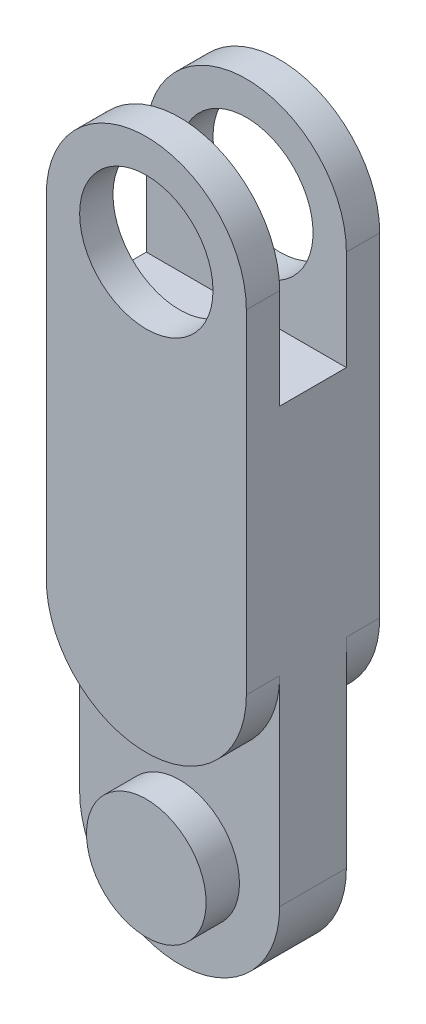
ISO-10303-21;
HEADER;
FILE_DESCRIPTION(('STEP AP214'),'2;1');
FILE_NAME('part.step','',(''),(''),'','','');
FILE_SCHEMA(('AUTOMOTIVE_DESIGN { 1 0 10303 214 1 1 1 1 }'));
ENDSEC;
DATA;
#1=APPLICATION_CONTEXT('core data for automotive mechanical design processes');
#2=APPLICATION_PROTOCOL_DEFINITION('international standard','automotive_design',2000,#1);
#3=PRODUCT_CONTEXT('',#1,'mechanical');
#4=PRODUCT('Part','Part','',(#3));
#5=PRODUCT_RELATED_PRODUCT_CATEGORY('part','',(#4));
#6=PRODUCT_DEFINITION_FORMATION('','',#4);
#7=PRODUCT_DEFINITION_CONTEXT('part definition',#1,'design');
#8=PRODUCT_DEFINITION('design','',#6,#7);
#9=PRODUCT_DEFINITION_SHAPE('','',#8);
#10=(LENGTH_UNIT() NAMED_UNIT(*) SI_UNIT(.MILLI.,.METRE.));
#11=(NAMED_UNIT(*) PLANE_ANGLE_UNIT() SI_UNIT($,.RADIAN.));
#12=(NAMED_UNIT(*) SI_UNIT($,.STERADIAN.) SOLID_ANGLE_UNIT());
#13=UNCERTAINTY_MEASURE_WITH_UNIT(LENGTH_MEASURE(1.E-05),#10,'distance_accuracy_value','');
#14=(GEOMETRIC_REPRESENTATION_CONTEXT(3) GLOBAL_UNCERTAINTY_ASSIGNED_CONTEXT((#13)) GLOBAL_UNIT_ASSIGNED_CONTEXT((#10,
#11,#12)) REPRESENTATION_CONTEXT('',''));
#15=CARTESIAN_POINT('',(0.,0.,0.));
#16=DIRECTION('',(0.,0.,1.));
#17=DIRECTION('',(1.,0.,0.));
#18=AXIS2_PLACEMENT_3D('',#15,#16,#17);
#19=CARTESIAN_POINT('',(-15.,0.,10.));
#20=DIRECTION('',(1.,0.,0.));
#21=DIRECTION('',(0.,0.,-1.));
#22=AXIS2_PLACEMENT_3D('',#19,#20,#21);
#23=PLANE('',#22);
#24=DIRECTION('',(0.,-1.,0.));
#25=VECTOR('',#24,1.);
#26=CARTESIAN_POINT('',(-15.,30.,5.));
#27=LINE('',#26,#25);
#28=CARTESIAN_POINT('',(-15.,30.,5.));
#29=VERTEX_POINT('',#28);
#30=CARTESIAN_POINT('',(-15.,0.,5.));
#31=VERTEX_POINT('',#30);
#32=EDGE_CURVE('E145',#29,#31,#27,.T.);
#33=ORIENTED_EDGE('',*,*,#32,.F.);
#34=DIRECTION('',(0.,0.,-1.));
#35=VECTOR('',#34,1.);
#36=CARTESIAN_POINT('',(-15.,30.,10.));
#37=LINE('',#36,#35);
#38=CARTESIAN_POINT('',(-15.,30.,10.));
#39=VERTEX_POINT('',#38);
#40=EDGE_CURVE('E132',#39,#29,#37,.T.);
#41=ORIENTED_EDGE('',*,*,#40,.F.);
#42=DIRECTION('',(0.,-1.,0.));
#43=VECTOR('',#42,1.);
#44=CARTESIAN_POINT('',(-15.,0.,10.));
#45=LINE('',#44,#43);
#46=CARTESIAN_POINT('',(-15.,80.,10.));
#47=VERTEX_POINT('',#46);
#48=EDGE_CURVE('E144',#47,#39,#45,.T.);
#49=ORIENTED_EDGE('',*,*,#48,.F.);
#50=DIRECTION('',(0.,0.,-1.));
#51=VECTOR('',#50,1.);
#52=CARTESIAN_POINT('',(-15.,80.,10.));
#53=LINE('',#52,#51);
#54=CARTESIAN_POINT('',(-15.,80.,5.));
#55=VERTEX_POINT('',#54);
#56=EDGE_CURVE('E169',#47,#55,#53,.T.);
#57=ORIENTED_EDGE('',*,*,#56,.T.);
#58=DIRECTION('',(0.,1.,0.));
#59=VECTOR('',#58,1.);
#60=CARTESIAN_POINT('',(-15.,65.,5.));
#61=LINE('',#60,#59);
#62=CARTESIAN_POINT('',(-15.,65.,5.));
#63=VERTEX_POINT('',#62);
#64=EDGE_CURVE('E210',#63,#55,#61,.T.);
#65=ORIENTED_EDGE('',*,*,#64,.F.);
#66=DIRECTION('',(0.,0.,1.));
#67=VECTOR('',#66,1.);
#68=CARTESIAN_POINT('',(-15.,65.,-5.));
#69=LINE('',#68,#67);
#70=CARTESIAN_POINT('',(-15.,65.,-5.));
#71=VERTEX_POINT('',#70);
#72=EDGE_CURVE('E213',#71,#63,#69,.T.);
#73=ORIENTED_EDGE('',*,*,#72,.F.);
#74=DIRECTION('',(0.,1.,0.));
#75=VECTOR('',#74,1.);
#76=CARTESIAN_POINT('',(-15.,65.,-5.));
#77=LINE('',#76,#75);
#78=CARTESIAN_POINT('',(-15.,80.,-5.));
#79=VERTEX_POINT('',#78);
#80=EDGE_CURVE('E186',#71,#79,#77,.T.);
#81=ORIENTED_EDGE('',*,*,#80,.T.);
#82=CARTESIAN_POINT('',(-15.,80.,-10.));
#83=VERTEX_POINT('',#82);
#84=EDGE_CURVE('E154',#79,#83,#53,.T.);
#85=ORIENTED_EDGE('',*,*,#84,.T.);
#86=DIRECTION('',(0.,-1.,0.));
#87=VECTOR('',#86,1.);
#88=CARTESIAN_POINT('',(-15.,0.,-10.));
#89=LINE('',#88,#87);
#90=CARTESIAN_POINT('',(-15.,30.,-10.));
#91=VERTEX_POINT('',#90);
#92=EDGE_CURVE('E166',#83,#91,#89,.T.);
#93=ORIENTED_EDGE('',*,*,#92,.T.);
#94=DIRECTION('',(0.,0.,1.));
#95=VECTOR('',#94,1.);
#96=CARTESIAN_POINT('',(-15.,30.,-10.));
#97=LINE('',#96,#95);
#98=CARTESIAN_POINT('',(-15.,30.,-5.));
#99=VERTEX_POINT('',#98);
#100=EDGE_CURVE('E223',#91,#99,#97,.T.);
#101=ORIENTED_EDGE('',*,*,#100,.T.);
#102=DIRECTION('',(0.,-1.,0.));
#103=VECTOR('',#102,1.);
#104=CARTESIAN_POINT('',(-15.,30.,-5.));
#105=LINE('',#104,#103);
#106=CARTESIAN_POINT('',(-15.,0.,-5.));
#107=VERTEX_POINT('',#106);
#108=EDGE_CURVE('E233',#99,#107,#105,.T.);
#109=ORIENTED_EDGE('',*,*,#108,.T.);
#110=DIRECTION('',(0.,0.,-1.));
#111=VECTOR('',#110,1.);
#112=CARTESIAN_POINT('',(-15.,0.,10.));
#113=LINE('',#112,#111);
#114=EDGE_CURVE('E64',#31,#107,#113,.T.);
#115=ORIENTED_EDGE('',*,*,#114,.F.);
#116=EDGE_LOOP('',(#33,#41,#49,#57,#65,#73,#81,#85,#93,#101,#109,#115));
#117=FACE_BOUND('',#116,.T.);
#118=ADVANCED_FACE('F39',(#117),#23,.F.);
#119=CARTESIAN_POINT('',(0.,0.,10.));
#120=DIRECTION('',(0.,0.,-1.));
#121=DIRECTION('',(-1.,0.,0.));
#122=AXIS2_PLACEMENT_3D('',#119,#120,#121);
#123=CYLINDRICAL_SURFACE('',#122,15.);
#124=CARTESIAN_POINT('',(0.,0.,5.));
#125=DIRECTION('',(0.,0.,1.));
#126=DIRECTION('',(1.,0.,0.));
#127=AXIS2_PLACEMENT_3D('',#124,#125,#126);
#128=CIRCLE('',#127,15.);
#129=CARTESIAN_POINT('',(15.,0.,5.));
#130=VERTEX_POINT('',#129);
#131=EDGE_CURVE('E248',#31,#130,#128,.T.);
#132=ORIENTED_EDGE('',*,*,#131,.F.);
#133=ORIENTED_EDGE('',*,*,#114,.T.);
#134=CARTESIAN_POINT('',(0.,0.,-5.));
#135=DIRECTION('',(0.,0.,1.));
#136=DIRECTION('',(1.,0.,0.));
#137=AXIS2_PLACEMENT_3D('',#134,#135,#136);
#138=CIRCLE('',#137,15.);
#139=CARTESIAN_POINT('',(15.,0.,-5.));
#140=VERTEX_POINT('',#139);
#141=EDGE_CURVE('E231',#107,#140,#138,.T.);
#142=ORIENTED_EDGE('',*,*,#141,.T.);
#143=DIRECTION('',(0.,0.,-1.));
#144=VECTOR('',#143,1.);
#145=CARTESIAN_POINT('',(15.,0.,10.));
#146=LINE('',#145,#144);
#147=EDGE_CURVE('E11',#130,#140,#146,.T.);
#148=ORIENTED_EDGE('',*,*,#147,.F.);
#149=EDGE_LOOP('',(#132,#133,#142,#148));
#150=FACE_BOUND('',#149,.T.);
#151=ADVANCED_FACE('F41',(#150),#123,.T.);
#152=CARTESIAN_POINT('',(15.,80.,10.));
#153=DIRECTION('',(-1.,0.,0.));
#154=DIRECTION('',(0.,0.,1.));
#155=AXIS2_PLACEMENT_3D('',#152,#153,#154);
#156=PLANE('',#155);
#157=DIRECTION('',(0.,1.,0.));
#158=VECTOR('',#157,1.);
#159=CARTESIAN_POINT('',(15.,30.,5.));
#160=LINE('',#159,#158);
#161=CARTESIAN_POINT('',(15.,30.,5.));
#162=VERTEX_POINT('',#161);
#163=EDGE_CURVE('E138',#130,#162,#160,.T.);
#164=ORIENTED_EDGE('',*,*,#163,.F.);
#165=ORIENTED_EDGE('',*,*,#147,.T.);
#166=DIRECTION('',(0.,1.,0.));
#167=VECTOR('',#166,1.);
#168=CARTESIAN_POINT('',(15.,30.,-5.));
#169=LINE('',#168,#167);
#170=CARTESIAN_POINT('',(15.,30.,-5.));
#171=VERTEX_POINT('',#170);
#172=EDGE_CURVE('E228',#140,#171,#169,.T.);
#173=ORIENTED_EDGE('',*,*,#172,.T.);
#174=DIRECTION('',(0.,0.,1.));
#175=VECTOR('',#174,1.);
#176=CARTESIAN_POINT('',(15.,30.,-10.));
#177=LINE('',#176,#175);
#178=CARTESIAN_POINT('',(15.,30.,-10.));
#179=VERTEX_POINT('',#178);
#180=EDGE_CURVE('E222',#179,#171,#177,.T.);
#181=ORIENTED_EDGE('',*,*,#180,.F.);
#182=DIRECTION('',(0.,1.,0.));
#183=VECTOR('',#182,1.);
#184=CARTESIAN_POINT('',(15.,80.,-10.));
#185=LINE('',#184,#183);
#186=CARTESIAN_POINT('',(15.,80.,-10.));
#187=VERTEX_POINT('',#186);
#188=EDGE_CURVE('E160',#179,#187,#185,.T.);
#189=ORIENTED_EDGE('',*,*,#188,.T.);
#190=DIRECTION('',(0.,0.,-1.));
#191=VECTOR('',#190,1.);
#192=CARTESIAN_POINT('',(15.,80.,10.));
#193=LINE('',#192,#191);
#194=CARTESIAN_POINT('',(15.,80.,-5.));
#195=VERTEX_POINT('',#194);
#196=EDGE_CURVE('E171',#195,#187,#193,.T.);
#197=ORIENTED_EDGE('',*,*,#196,.F.);
#198=DIRECTION('',(0.,1.,0.));
#199=VECTOR('',#198,1.);
#200=CARTESIAN_POINT('',(15.,65.,-5.));
#201=LINE('',#200,#199);
#202=CARTESIAN_POINT('',(15.,65.,-5.));
#203=VERTEX_POINT('',#202);
#204=EDGE_CURVE('E215',#203,#195,#201,.T.);
#205=ORIENTED_EDGE('',*,*,#204,.F.);
#206=DIRECTION('',(0.,0.,1.));
#207=VECTOR('',#206,1.);
#208=CARTESIAN_POINT('',(15.,65.,-5.));
#209=LINE('',#208,#207);
#210=CARTESIAN_POINT('',(15.,65.,5.));
#211=VERTEX_POINT('',#210);
#212=EDGE_CURVE('E217',#203,#211,#209,.T.);
#213=ORIENTED_EDGE('',*,*,#212,.T.);
#214=DIRECTION('',(0.,1.,0.));
#215=VECTOR('',#214,1.);
#216=CARTESIAN_POINT('',(15.,65.,5.));
#217=LINE('',#216,#215);
#218=CARTESIAN_POINT('',(15.,80.,5.));
#219=VERTEX_POINT('',#218);
#220=EDGE_CURVE('E204',#211,#219,#217,.T.);
#221=ORIENTED_EDGE('',*,*,#220,.T.);
#222=CARTESIAN_POINT('',(15.,80.,10.));
#223=VERTEX_POINT('',#222);
#224=EDGE_CURVE('E48',#223,#219,#193,.T.);
#225=ORIENTED_EDGE('',*,*,#224,.F.);
#226=DIRECTION('',(0.,1.,0.));
#227=VECTOR('',#226,1.);
#228=CARTESIAN_POINT('',(15.,80.,10.));
#229=LINE('',#228,#227);
#230=CARTESIAN_POINT('',(15.,30.,10.));
#231=VERTEX_POINT('',#230);
#232=EDGE_CURVE('E156',#231,#223,#229,.T.);
#233=ORIENTED_EDGE('',*,*,#232,.F.);
#234=DIRECTION('',(0.,0.,-1.));
#235=VECTOR('',#234,1.);
#236=CARTESIAN_POINT('',(15.,30.,10.));
#237=LINE('',#236,#235);
#238=EDGE_CURVE('E134',#231,#162,#237,.T.);
#239=ORIENTED_EDGE('',*,*,#238,.T.);
#240=EDGE_LOOP('',(#164,#165,#173,#181,#189,#197,#205,#213,#221,#225,#233,#239));
#241=FACE_BOUND('',#240,.T.);
#242=ADVANCED_FACE('F201',(#241),#156,.F.);
#243=CARTESIAN_POINT('',(0.,80.,10.));
#244=DIRECTION('',(0.,0.,-1.));
#245=DIRECTION('',(-1.,0.,0.));
#246=AXIS2_PLACEMENT_3D('',#243,#244,#245);
#247=CYLINDRICAL_SURFACE('',#246,15.);
#248=CARTESIAN_POINT('',(0.,80.,5.));
#249=DIRECTION('',(0.,0.,-1.));
#250=DIRECTION('',(-1.,0.,0.));
#251=AXIS2_PLACEMENT_3D('',#248,#249,#250);
#252=CIRCLE('',#251,15.);
#253=EDGE_CURVE('E175',#55,#219,#252,.T.);
#254=ORIENTED_EDGE('',*,*,#253,.F.);
#255=ORIENTED_EDGE('',*,*,#56,.F.);
#256=CARTESIAN_POINT('',(0.,80.,10.));
#257=DIRECTION('',(0.,0.,1.));
#258=DIRECTION('',(1.,0.,0.));
#259=AXIS2_PLACEMENT_3D('',#256,#257,#258);
#260=CIRCLE('',#259,15.);
#261=EDGE_CURVE('E151',#223,#47,#260,.T.);
#262=ORIENTED_EDGE('',*,*,#261,.F.);
#263=ORIENTED_EDGE('',*,*,#224,.T.);
#264=EDGE_LOOP('',(#254,#255,#262,#263));
#265=FACE_BOUND('',#264,.T.);
#266=ADVANCED_FACE('F207',(#265),#247,.T.);
#267=CARTESIAN_POINT('',(0.,80.,10.));
#268=DIRECTION('',(0.,0.,-1.));
#269=DIRECTION('',(-1.,0.,0.));
#270=AXIS2_PLACEMENT_3D('',#267,#268,#269);
#271=CYLINDRICAL_SURFACE('',#270,10.);
#272=CARTESIAN_POINT('',(0.,80.,10.));
#273=DIRECTION('',(0.,0.,1.));
#274=DIRECTION('',(1.,0.,0.));
#275=AXIS2_PLACEMENT_3D('',#272,#273,#274);
#276=CIRCLE('',#275,10.);
#277=CARTESIAN_POINT('',(10.,80.,10.));
#278=VERTEX_POINT('',#277);
#279=EDGE_CURVE('E163',#278,#278,#276,.T.);
#280=ORIENTED_EDGE('',*,*,#279,.T.);
#281=EDGE_LOOP('',(#280));
#282=FACE_BOUND('',#281,.T.);
#283=CARTESIAN_POINT('',(0.,80.,5.));
#284=DIRECTION('',(0.,0.,-1.));
#285=DIRECTION('',(-1.,0.,0.));
#286=AXIS2_PLACEMENT_3D('',#283,#284,#285);
#287=CIRCLE('',#286,10.);
#288=CARTESIAN_POINT('',(-10.,80.,5.));
#289=VERTEX_POINT('',#288);
#290=EDGE_CURVE('E173',#289,#289,#287,.T.);
#291=ORIENTED_EDGE('',*,*,#290,.T.);
#292=EDGE_LOOP('',(#291));
#293=FACE_BOUND('',#292,.T.);
#294=ADVANCED_FACE('F296',(#282,#293),#271,.F.);
#295=CARTESIAN_POINT('',(0.,0.,10.));
#296=DIRECTION('',(0.,0.,1.));
#297=DIRECTION('',(1.,0.,0.));
#298=AXIS2_PLACEMENT_3D('',#295,#296,#297);
#299=PLANE('',#298);
#300=ORIENTED_EDGE('',*,*,#48,.T.);
#301=CARTESIAN_POINT('',(0.,30.,10.));
#302=DIRECTION('',(0.,0.,-1.));
#303=DIRECTION('',(1.,0.,0.));
#304=AXIS2_PLACEMENT_3D('',#301,#302,#303);
#305=CIRCLE('',#304,15.);
#306=EDGE_CURVE('E129',#231,#39,#305,.T.);
#307=ORIENTED_EDGE('',*,*,#306,.F.);
#308=ORIENTED_EDGE('',*,*,#232,.T.);
#309=ORIENTED_EDGE('',*,*,#261,.T.);
#310=EDGE_LOOP('',(#300,#307,#308,#309));
#311=FACE_BOUND('',#310,.T.);
#312=ORIENTED_EDGE('',*,*,#279,.F.);
#313=EDGE_LOOP('',(#312));
#314=FACE_BOUND('',#313,.T.);
#315=ADVANCED_FACE('F148',(#311,#314),#299,.T.);
#316=CARTESIAN_POINT('',(0.,0.,-10.));
#317=DIRECTION('',(0.,0.,1.));
#318=DIRECTION('',(1.,0.,0.));
#319=AXIS2_PLACEMENT_3D('',#316,#317,#318);
#320=PLANE('',#319);
#321=ORIENTED_EDGE('',*,*,#188,.F.);
#322=CARTESIAN_POINT('',(0.,30.,-10.));
#323=DIRECTION('',(0.,0.,-1.));
#324=DIRECTION('',(1.,0.,0.));
#325=AXIS2_PLACEMENT_3D('',#322,#323,#324);
#326=CIRCLE('',#325,15.);
#327=EDGE_CURVE('E226',#179,#91,#326,.T.);
#328=ORIENTED_EDGE('',*,*,#327,.T.);
#329=ORIENTED_EDGE('',*,*,#92,.F.);
#330=CARTESIAN_POINT('',(0.,80.,-10.));
#331=DIRECTION('',(0.,0.,1.));
#332=DIRECTION('',(1.,0.,0.));
#333=AXIS2_PLACEMENT_3D('',#330,#331,#332);
#334=CIRCLE('',#333,15.);
#335=EDGE_CURVE('E162',#187,#83,#334,.T.);
#336=ORIENTED_EDGE('',*,*,#335,.F.);
#337=EDGE_LOOP('',(#321,#328,#329,#336));
#338=FACE_BOUND('',#337,.T.);
#339=CARTESIAN_POINT('',(0.,80.,-10.));
#340=DIRECTION('',(0.,0.,1.));
#341=DIRECTION('',(1.,0.,0.));
#342=AXIS2_PLACEMENT_3D('',#339,#340,#341);
#343=CIRCLE('',#342,10.);
#344=CARTESIAN_POINT('',(10.,80.,-10.));
#345=VERTEX_POINT('',#344);
#346=EDGE_CURVE('E193',#345,#345,#343,.T.);
#347=ORIENTED_EDGE('',*,*,#346,.T.);
#348=EDGE_LOOP('',(#347));
#349=FACE_BOUND('',#348,.T.);
#350=ADVANCED_FACE('F280',(#338,#349),#320,.F.);
#351=ORIENTED_EDGE('',*,*,#84,.F.);
#352=CARTESIAN_POINT('',(0.,80.,-5.));
#353=DIRECTION('',(0.,0.,-1.));
#354=DIRECTION('',(-1.,0.,0.));
#355=AXIS2_PLACEMENT_3D('',#352,#353,#354);
#356=CIRCLE('',#355,15.);
#357=EDGE_CURVE('E191',#79,#195,#356,.T.);
#358=ORIENTED_EDGE('',*,*,#357,.T.);
#359=ORIENTED_EDGE('',*,*,#196,.T.);
#360=ORIENTED_EDGE('',*,*,#335,.T.);
#361=EDGE_LOOP('',(#351,#358,#359,#360));
#362=FACE_BOUND('',#361,.T.);
#363=ADVANCED_FACE('F288',(#362),#247,.T.);
#364=CARTESIAN_POINT('',(0.,80.,-5.));
#365=DIRECTION('',(0.,0.,-1.));
#366=DIRECTION('',(-1.,0.,0.));
#367=AXIS2_PLACEMENT_3D('',#364,#365,#366);
#368=CIRCLE('',#367,10.);
#369=CARTESIAN_POINT('',(-10.,80.,-5.));
#370=VERTEX_POINT('',#369);
#371=EDGE_CURVE('E43',#370,#370,#368,.T.);
#372=ORIENTED_EDGE('',*,*,#371,.F.);
#373=EDGE_LOOP('',(#372));
#374=FACE_BOUND('',#373,.T.);
#375=ORIENTED_EDGE('',*,*,#346,.F.);
#376=EDGE_LOOP('',(#375));
#377=FACE_BOUND('',#376,.T.);
#378=ADVANCED_FACE('F290',(#374,#377),#271,.F.);
#379=CARTESIAN_POINT('',(-15.,65.,-5.));
#380=DIRECTION('',(0.,0.,-1.));
#381=DIRECTION('',(-1.,0.,0.));
#382=AXIS2_PLACEMENT_3D('',#379,#380,#381);
#383=PLANE('',#382);
#384=ORIENTED_EDGE('',*,*,#371,.T.);
#385=EDGE_LOOP('',(#384));
#386=FACE_BOUND('',#385,.T.);
#387=ORIENTED_EDGE('',*,*,#80,.F.);
#388=DIRECTION('',(1.,0.,0.));
#389=VECTOR('',#388,1.);
#390=CARTESIAN_POINT('',(-15.,65.,-5.));
#391=LINE('',#390,#389);
#392=EDGE_CURVE('E176',#71,#203,#391,.T.);
#393=ORIENTED_EDGE('',*,*,#392,.T.);
#394=ORIENTED_EDGE('',*,*,#204,.T.);
#395=ORIENTED_EDGE('',*,*,#357,.F.);
#396=EDGE_LOOP('',(#387,#393,#394,#395));
#397=FACE_BOUND('',#396,.T.);
#398=ADVANCED_FACE('F307',(#386,#397),#383,.F.);
#399=CARTESIAN_POINT('',(-15.,65.,5.));
#400=DIRECTION('',(0.,0.,-1.));
#401=DIRECTION('',(-1.,0.,0.));
#402=AXIS2_PLACEMENT_3D('',#399,#400,#401);
#403=PLANE('',#402);
#404=ORIENTED_EDGE('',*,*,#290,.F.);
#405=EDGE_LOOP('',(#404));
#406=FACE_BOUND('',#405,.T.);
#407=ORIENTED_EDGE('',*,*,#253,.T.);
#408=ORIENTED_EDGE('',*,*,#220,.F.);
#409=DIRECTION('',(1.,0.,0.));
#410=VECTOR('',#409,1.);
#411=CARTESIAN_POINT('',(-15.,65.,5.));
#412=LINE('',#411,#410);
#413=EDGE_CURVE('E180',#63,#211,#412,.T.);
#414=ORIENTED_EDGE('',*,*,#413,.F.);
#415=ORIENTED_EDGE('',*,*,#64,.T.);
#416=EDGE_LOOP('',(#407,#408,#414,#415));
#417=FACE_BOUND('',#416,.T.);
#418=ADVANCED_FACE('F312',(#406,#417),#403,.T.);
#419=CARTESIAN_POINT('',(-15.,65.,-5.));
#420=DIRECTION('',(0.,1.,0.));
#421=DIRECTION('',(0.,0.,1.));
#422=AXIS2_PLACEMENT_3D('',#419,#420,#421);
#423=PLANE('',#422);
#424=ORIENTED_EDGE('',*,*,#392,.F.);
#425=ORIENTED_EDGE('',*,*,#72,.T.);
#426=ORIENTED_EDGE('',*,*,#413,.T.);
#427=ORIENTED_EDGE('',*,*,#212,.F.);
#428=EDGE_LOOP('',(#424,#425,#426,#427));
#429=FACE_BOUND('',#428,.T.);
#430=ADVANCED_FACE('F333',(#429),#423,.T.);
#431=CARTESIAN_POINT('',(0.,30.,-10.));
#432=DIRECTION('',(0.,0.,1.));
#433=DIRECTION('',(1.,0.,0.));
#434=AXIS2_PLACEMENT_3D('',#431,#432,#433);
#435=CYLINDRICAL_SURFACE('',#434,15.);
#436=CARTESIAN_POINT('',(0.,30.,-5.));
#437=DIRECTION('',(0.,0.,-1.));
#438=DIRECTION('',(1.,0.,0.));
#439=AXIS2_PLACEMENT_3D('',#436,#437,#438);
#440=CIRCLE('',#439,15.);
#441=EDGE_CURVE('E236',#171,#99,#440,.T.);
#442=ORIENTED_EDGE('',*,*,#441,.T.);
#443=ORIENTED_EDGE('',*,*,#100,.F.);
#444=ORIENTED_EDGE('',*,*,#327,.F.);
#445=ORIENTED_EDGE('',*,*,#180,.T.);
#446=EDGE_LOOP('',(#442,#443,#444,#445));
#447=FACE_BOUND('',#446,.T.);
#448=ADVANCED_FACE('F339',(#447),#435,.T.);
#449=CARTESIAN_POINT('',(0.,30.,-5.));
#450=DIRECTION('',(0.,0.,1.));
#451=DIRECTION('',(1.,0.,0.));
#452=AXIS2_PLACEMENT_3D('',#449,#450,#451);
#453=PLANE('',#452);
#454=CARTESIAN_POINT('',(0.,0.,-5.));
#455=DIRECTION('',(0.,0.,1.));
#456=DIRECTION('',(1.,0.,0.));
#457=AXIS2_PLACEMENT_3D('',#454,#455,#456);
#458=CIRCLE('',#457,8.96850736733155);
#459=CARTESIAN_POINT('',(8.96850736733155,0.,-5.));
#460=VERTEX_POINT('',#459);
#461=EDGE_CURVE('E146',#460,#460,#458,.T.);
#462=ORIENTED_EDGE('',*,*,#461,.T.);
#463=EDGE_LOOP('',(#462));
#464=FACE_BOUND('',#463,.T.);
#465=ORIENTED_EDGE('',*,*,#441,.F.);
#466=ORIENTED_EDGE('',*,*,#172,.F.);
#467=ORIENTED_EDGE('',*,*,#141,.F.);
#468=ORIENTED_EDGE('',*,*,#108,.F.);
#469=EDGE_LOOP('',(#465,#466,#467,#468));
#470=FACE_BOUND('',#469,.T.);
#471=ADVANCED_FACE('F344',(#464,#470),#453,.F.);
#472=CARTESIAN_POINT('',(0.,0.,-10.));
#473=DIRECTION('',(0.,0.,1.));
#474=DIRECTION('',(1.,0.,0.));
#475=AXIS2_PLACEMENT_3D('',#472,#473,#474);
#476=CYLINDRICAL_SURFACE('',#475,8.96850736733155);
#477=CARTESIAN_POINT('',(0.,0.,-10.));
#478=DIRECTION('',(0.,0.,1.));
#479=DIRECTION('',(1.,0.,0.));
#480=AXIS2_PLACEMENT_3D('',#477,#478,#479);
#481=CIRCLE('',#480,8.96850736733155);
#482=CARTESIAN_POINT('',(8.96850736733155,0.,-10.));
#483=VERTEX_POINT('',#482);
#484=EDGE_CURVE('E239',#483,#483,#481,.T.);
#485=ORIENTED_EDGE('',*,*,#484,.T.);
#486=EDGE_LOOP('',(#485));
#487=FACE_BOUND('',#486,.T.);
#488=ORIENTED_EDGE('',*,*,#461,.F.);
#489=EDGE_LOOP('',(#488));
#490=FACE_BOUND('',#489,.T.);
#491=ADVANCED_FACE('F277',(#487,#490),#476,.T.);
#492=ORIENTED_EDGE('',*,*,#484,.F.);
#493=EDGE_LOOP('',(#492));
#494=FACE_BOUND('',#493,.T.);
#495=ADVANCED_FACE('F269',(#494),#320,.F.);
#496=CARTESIAN_POINT('',(0.,30.,5.));
#497=DIRECTION('',(0.,0.,1.));
#498=DIRECTION('',(1.,0.,0.));
#499=AXIS2_PLACEMENT_3D('',#496,#497,#498);
#500=PLANE('',#499);
#501=CARTESIAN_POINT('',(0.,30.,5.));
#502=DIRECTION('',(0.,0.,-1.));
#503=DIRECTION('',(1.,0.,0.));
#504=AXIS2_PLACEMENT_3D('',#501,#502,#503);
#505=CIRCLE('',#504,15.);
#506=EDGE_CURVE('E56',#162,#29,#505,.T.);
#507=ORIENTED_EDGE('',*,*,#506,.T.);
#508=ORIENTED_EDGE('',*,*,#32,.T.);
#509=ORIENTED_EDGE('',*,*,#131,.T.);
#510=ORIENTED_EDGE('',*,*,#163,.T.);
#511=EDGE_LOOP('',(#507,#508,#509,#510));
#512=FACE_BOUND('',#511,.T.);
#513=CARTESIAN_POINT('',(0.,0.,5.));
#514=DIRECTION('',(0.,0.,1.));
#515=DIRECTION('',(1.,0.,0.));
#516=AXIS2_PLACEMENT_3D('',#513,#514,#515);
#517=CIRCLE('',#516,8.96850736733155);
#518=CARTESIAN_POINT('',(8.96850736733155,0.,5.));
#519=VERTEX_POINT('',#518);
#520=EDGE_CURVE('E253',#519,#519,#517,.T.);
#521=ORIENTED_EDGE('',*,*,#520,.F.);
#522=EDGE_LOOP('',(#521));
#523=FACE_BOUND('',#522,.T.);
#524=ADVANCED_FACE('F267',(#512,#523),#500,.T.);
#525=CARTESIAN_POINT('',(0.,30.,10.));
#526=DIRECTION('',(0.,0.,-1.));
#527=DIRECTION('',(-1.,0.,0.));
#528=AXIS2_PLACEMENT_3D('',#525,#526,#527);
#529=CYLINDRICAL_SURFACE('',#528,15.);
#530=ORIENTED_EDGE('',*,*,#506,.F.);
#531=ORIENTED_EDGE('',*,*,#238,.F.);
#532=ORIENTED_EDGE('',*,*,#306,.T.);
#533=ORIENTED_EDGE('',*,*,#40,.T.);
#534=EDGE_LOOP('',(#530,#531,#532,#533));
#535=FACE_BOUND('',#534,.T.);
#536=ADVANCED_FACE('F131',(#535),#529,.T.);
#537=CARTESIAN_POINT('',(0.,0.,10.));
#538=DIRECTION('',(0.,0.,-1.));
#539=DIRECTION('',(-1.,0.,0.));
#540=AXIS2_PLACEMENT_3D('',#537,#538,#539);
#541=CYLINDRICAL_SURFACE('',#540,8.96850736733155);
#542=CARTESIAN_POINT('',(0.,0.,10.));
#543=DIRECTION('',(0.,0.,1.));
#544=DIRECTION('',(1.,0.,0.));
#545=AXIS2_PLACEMENT_3D('',#542,#543,#544);
#546=CIRCLE('',#545,8.96850736733155);
#547=CARTESIAN_POINT('',(8.96850736733155,0.,10.));
#548=VERTEX_POINT('',#547);
#549=EDGE_CURVE('E251',#548,#548,#546,.T.);
#550=ORIENTED_EDGE('',*,*,#549,.F.);
#551=EDGE_LOOP('',(#550));
#552=FACE_BOUND('',#551,.T.);
#553=ORIENTED_EDGE('',*,*,#520,.T.);
#554=EDGE_LOOP('',(#553));
#555=FACE_BOUND('',#554,.T.);
#556=ADVANCED_FACE('F261',(#552,#555),#541,.T.);
#557=ORIENTED_EDGE('',*,*,#549,.T.);
#558=EDGE_LOOP('',(#557));
#559=FACE_BOUND('',#558,.T.);
#560=ADVANCED_FACE('F259',(#559),#299,.T.);
#561=CLOSED_SHELL('',(#118,#151,#242,#266,#294,#315,#350,#363,#378,#398,#418,#430,#448,#471,
#491,#495,#524,#536,#556,#560));
#562=MANIFOLD_SOLID_BREP('B2',#561);
#563=ADVANCED_BREP_SHAPE_REPRESENTATION('',(#18,#562),#14);
#564=SHAPE_DEFINITION_REPRESENTATION(#9,#563);
ENDSEC;
END-ISO-10303-21;
